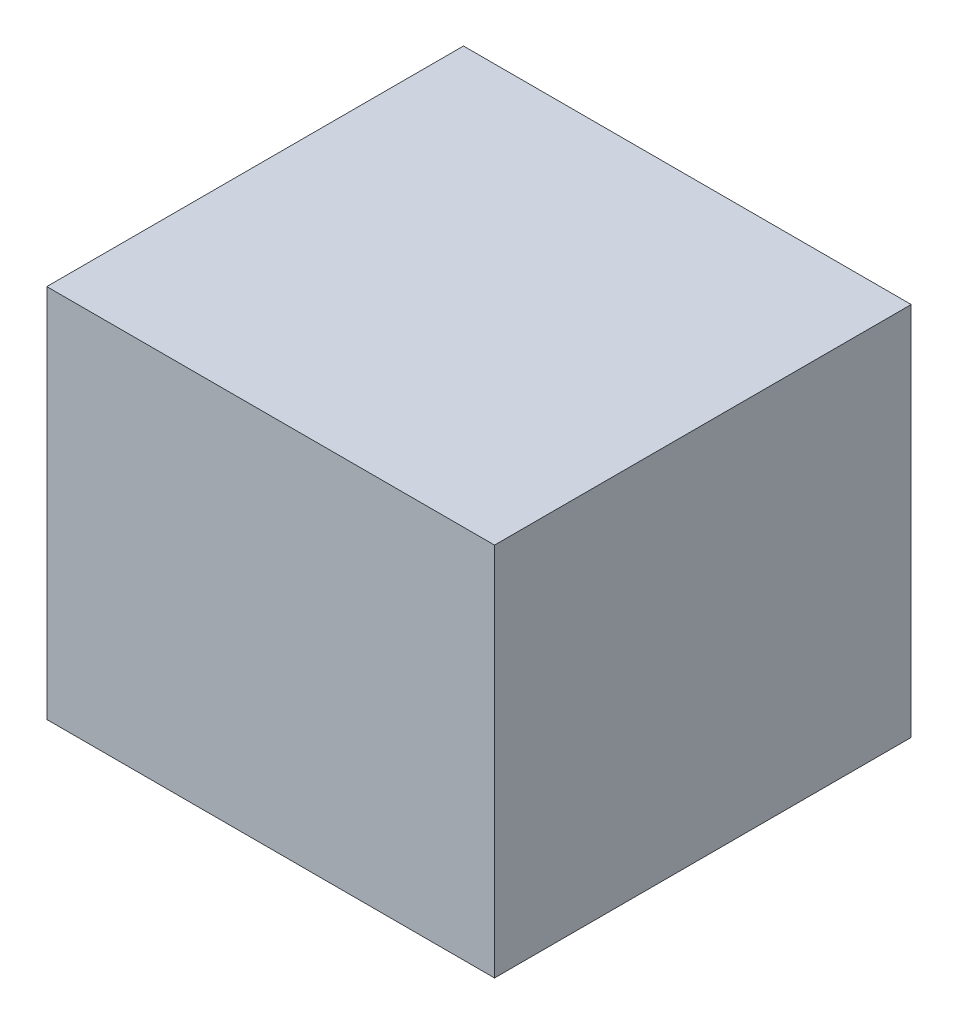
ISO-10303-21;
HEADER;
FILE_DESCRIPTION(('STEP AP214'),'2;1');
FILE_NAME('part.step','',(''),(''),'','','');
FILE_SCHEMA(('AUTOMOTIVE_DESIGN { 1 0 10303 214 1 1 1 1 }'));
ENDSEC;
DATA;
#1=APPLICATION_CONTEXT('core data for automotive mechanical design processes');
#2=APPLICATION_PROTOCOL_DEFINITION('international standard','automotive_design',2000,#1);
#3=PRODUCT_CONTEXT('',#1,'mechanical');
#4=PRODUCT('Part','Part','',(#3));
#5=PRODUCT_RELATED_PRODUCT_CATEGORY('part','',(#4));
#6=PRODUCT_DEFINITION_FORMATION('','',#4);
#7=PRODUCT_DEFINITION_CONTEXT('part definition',#1,'design');
#8=PRODUCT_DEFINITION('design','',#6,#7);
#9=PRODUCT_DEFINITION_SHAPE('','',#8);
#10=(LENGTH_UNIT() NAMED_UNIT(*) SI_UNIT(.MILLI.,.METRE.));
#11=(NAMED_UNIT(*) PLANE_ANGLE_UNIT() SI_UNIT($,.RADIAN.));
#12=(NAMED_UNIT(*) SI_UNIT($,.STERADIAN.) SOLID_ANGLE_UNIT());
#13=UNCERTAINTY_MEASURE_WITH_UNIT(LENGTH_MEASURE(1.E-05),#10,'distance_accuracy_value','');
#14=(GEOMETRIC_REPRESENTATION_CONTEXT(3) GLOBAL_UNCERTAINTY_ASSIGNED_CONTEXT((#13)) GLOBAL_UNIT_ASSIGNED_CONTEXT((#10,
#11,#12)) REPRESENTATION_CONTEXT('',''));
#15=CARTESIAN_POINT('',(0.,0.,0.));
#16=DIRECTION('',(0.,0.,1.));
#17=DIRECTION('',(1.,0.,0.));
#18=AXIS2_PLACEMENT_3D('',#15,#16,#17);
#19=CARTESIAN_POINT('',(41.8,-17.5,-19.45));
#20=DIRECTION('',(0.,0.,1.));
#21=DIRECTION('',(1.,0.,0.));
#22=AXIS2_PLACEMENT_3D('',#19,#20,#21);
#23=PLANE('',#22);
#24=DIRECTION('',(0.,1.,0.));
#25=VECTOR('',#24,1.);
#26=CARTESIAN_POINT('',(0.,-17.5,-19.45));
#27=LINE('',#26,#25);
#28=CARTESIAN_POINT('',(0.,-17.5,-19.45));
#29=VERTEX_POINT('',#28);
#30=CARTESIAN_POINT('',(0.,17.5,-19.45));
#31=VERTEX_POINT('',#30);
#32=EDGE_CURVE('E96',#29,#31,#27,.T.);
#33=ORIENTED_EDGE('',*,*,#32,.T.);
#34=DIRECTION('',(-1.,0.,0.));
#35=VECTOR('',#34,1.);
#36=CARTESIAN_POINT('',(41.8,17.5,-19.45));
#37=LINE('',#36,#35);
#38=CARTESIAN_POINT('',(41.8,17.5,-19.45));
#39=VERTEX_POINT('',#38);
#40=EDGE_CURVE('E11',#39,#31,#37,.T.);
#41=ORIENTED_EDGE('',*,*,#40,.F.);
#42=DIRECTION('',(0.,1.,0.));
#43=VECTOR('',#42,1.);
#44=CARTESIAN_POINT('',(41.8,-17.5,-19.45));
#45=LINE('',#44,#43);
#46=CARTESIAN_POINT('',(41.8,-17.5,-19.45));
#47=VERTEX_POINT('',#46);
#48=EDGE_CURVE('E84',#47,#39,#45,.T.);
#49=ORIENTED_EDGE('',*,*,#48,.F.);
#50=DIRECTION('',(-1.,0.,0.));
#51=VECTOR('',#50,1.);
#52=CARTESIAN_POINT('',(41.8,-17.5,-19.45));
#53=LINE('',#52,#51);
#54=EDGE_CURVE('E92',#47,#29,#53,.T.);
#55=ORIENTED_EDGE('',*,*,#54,.T.);
#56=EDGE_LOOP('',(#33,#41,#49,#55));
#57=FACE_BOUND('',#56,.T.);
#58=ADVANCED_FACE('F33',(#57),#23,.F.);
#59=CARTESIAN_POINT('',(41.8,17.5,19.45));
#60=DIRECTION('',(0.,-1.,0.));
#61=DIRECTION('',(0.,0.,-1.));
#62=AXIS2_PLACEMENT_3D('',#59,#60,#61);
#63=PLANE('',#62);
#64=DIRECTION('',(0.,0.,1.));
#65=VECTOR('',#64,1.);
#66=CARTESIAN_POINT('',(0.,17.5,19.45));
#67=LINE('',#66,#65);
#68=CARTESIAN_POINT('',(0.,17.5,19.45));
#69=VERTEX_POINT('',#68);
#70=EDGE_CURVE('E88',#31,#69,#67,.T.);
#71=ORIENTED_EDGE('',*,*,#70,.T.);
#72=DIRECTION('',(-1.,0.,0.));
#73=VECTOR('',#72,1.);
#74=CARTESIAN_POINT('',(41.8,17.5,19.45));
#75=LINE('',#74,#73);
#76=CARTESIAN_POINT('',(41.8,17.5,19.45));
#77=VERTEX_POINT('',#76);
#78=EDGE_CURVE('E41',#77,#69,#75,.T.);
#79=ORIENTED_EDGE('',*,*,#78,.F.);
#80=DIRECTION('',(0.,0.,1.));
#81=VECTOR('',#80,1.);
#82=CARTESIAN_POINT('',(41.8,17.5,19.45));
#83=LINE('',#82,#81);
#84=EDGE_CURVE('E79',#39,#77,#83,.T.);
#85=ORIENTED_EDGE('',*,*,#84,.F.);
#86=ORIENTED_EDGE('',*,*,#40,.T.);
#87=EDGE_LOOP('',(#71,#79,#85,#86));
#88=FACE_BOUND('',#87,.T.);
#89=ADVANCED_FACE('F87',(#88),#63,.F.);
#90=CARTESIAN_POINT('',(41.8,-17.5,19.45));
#91=DIRECTION('',(0.,0.,-1.));
#92=DIRECTION('',(-1.,0.,0.));
#93=AXIS2_PLACEMENT_3D('',#90,#91,#92);
#94=PLANE('',#93);
#95=DIRECTION('',(0.,-1.,0.));
#96=VECTOR('',#95,1.);
#97=CARTESIAN_POINT('',(0.,-17.5,19.45));
#98=LINE('',#97,#96);
#99=CARTESIAN_POINT('',(0.,-17.5,19.45));
#100=VERTEX_POINT('',#99);
#101=EDGE_CURVE('E66',#69,#100,#98,.T.);
#102=ORIENTED_EDGE('',*,*,#101,.T.);
#103=DIRECTION('',(-1.,0.,0.));
#104=VECTOR('',#103,1.);
#105=CARTESIAN_POINT('',(41.8,-17.5,19.45));
#106=LINE('',#105,#104);
#107=CARTESIAN_POINT('',(41.8,-17.5,19.45));
#108=VERTEX_POINT('',#107);
#109=EDGE_CURVE('E89',#108,#100,#106,.T.);
#110=ORIENTED_EDGE('',*,*,#109,.F.);
#111=DIRECTION('',(0.,-1.,0.));
#112=VECTOR('',#111,1.);
#113=CARTESIAN_POINT('',(41.8,-17.5,19.45));
#114=LINE('',#113,#112);
#115=EDGE_CURVE('E82',#77,#108,#114,.T.);
#116=ORIENTED_EDGE('',*,*,#115,.F.);
#117=ORIENTED_EDGE('',*,*,#78,.T.);
#118=EDGE_LOOP('',(#102,#110,#116,#117));
#119=FACE_BOUND('',#118,.T.);
#120=ADVANCED_FACE('F90',(#119),#94,.F.);
#121=CARTESIAN_POINT('',(41.8,-17.5,19.45));
#122=DIRECTION('',(0.,1.,0.));
#123=DIRECTION('',(0.,0.,1.));
#124=AXIS2_PLACEMENT_3D('',#121,#122,#123);
#125=PLANE('',#124);
#126=DIRECTION('',(0.,0.,-1.));
#127=VECTOR('',#126,1.);
#128=CARTESIAN_POINT('',(0.,-17.5,19.45));
#129=LINE('',#128,#127);
#130=EDGE_CURVE('E72',#100,#29,#129,.T.);
#131=ORIENTED_EDGE('',*,*,#130,.T.);
#132=ORIENTED_EDGE('',*,*,#54,.F.);
#133=DIRECTION('',(0.,0.,-1.));
#134=VECTOR('',#133,1.);
#135=CARTESIAN_POINT('',(41.8,-17.5,19.45));
#136=LINE('',#135,#134);
#137=EDGE_CURVE('E49',#108,#47,#136,.T.);
#138=ORIENTED_EDGE('',*,*,#137,.F.);
#139=ORIENTED_EDGE('',*,*,#109,.T.);
#140=EDGE_LOOP('',(#131,#132,#138,#139));
#141=FACE_BOUND('',#140,.T.);
#142=ADVANCED_FACE('F103',(#141),#125,.F.);
#143=CARTESIAN_POINT('',(41.8,0.,0.));
#144=DIRECTION('',(-1.,0.,0.));
#145=DIRECTION('',(0.,0.,1.));
#146=AXIS2_PLACEMENT_3D('',#143,#144,#145);
#147=PLANE('',#146);
#148=ORIENTED_EDGE('',*,*,#48,.T.);
#149=ORIENTED_EDGE('',*,*,#84,.T.);
#150=ORIENTED_EDGE('',*,*,#115,.T.);
#151=ORIENTED_EDGE('',*,*,#137,.T.);
#152=EDGE_LOOP('',(#148,#149,#150,#151));
#153=FACE_BOUND('',#152,.T.);
#154=ADVANCED_FACE('F80',(#153),#147,.F.);
#155=CARTESIAN_POINT('',(0.,0.,0.));
#156=DIRECTION('',(-1.,0.,0.));
#157=DIRECTION('',(0.,0.,1.));
#158=AXIS2_PLACEMENT_3D('',#155,#156,#157);
#159=PLANE('',#158);
#160=ORIENTED_EDGE('',*,*,#32,.F.);
#161=ORIENTED_EDGE('',*,*,#130,.F.);
#162=ORIENTED_EDGE('',*,*,#101,.F.);
#163=ORIENTED_EDGE('',*,*,#70,.F.);
#164=EDGE_LOOP('',(#160,#161,#162,#163));
#165=FACE_BOUND('',#164,.T.);
#166=ADVANCED_FACE('F106',(#165),#159,.T.);
#167=CLOSED_SHELL('',(#58,#89,#120,#142,#154,#166));
#168=MANIFOLD_SOLID_BREP('B2',#167);
#169=ADVANCED_BREP_SHAPE_REPRESENTATION('',(#18,#168),#14);
#170=SHAPE_DEFINITION_REPRESENTATION(#9,#169);
ENDSEC;
END-ISO-10303-21;
